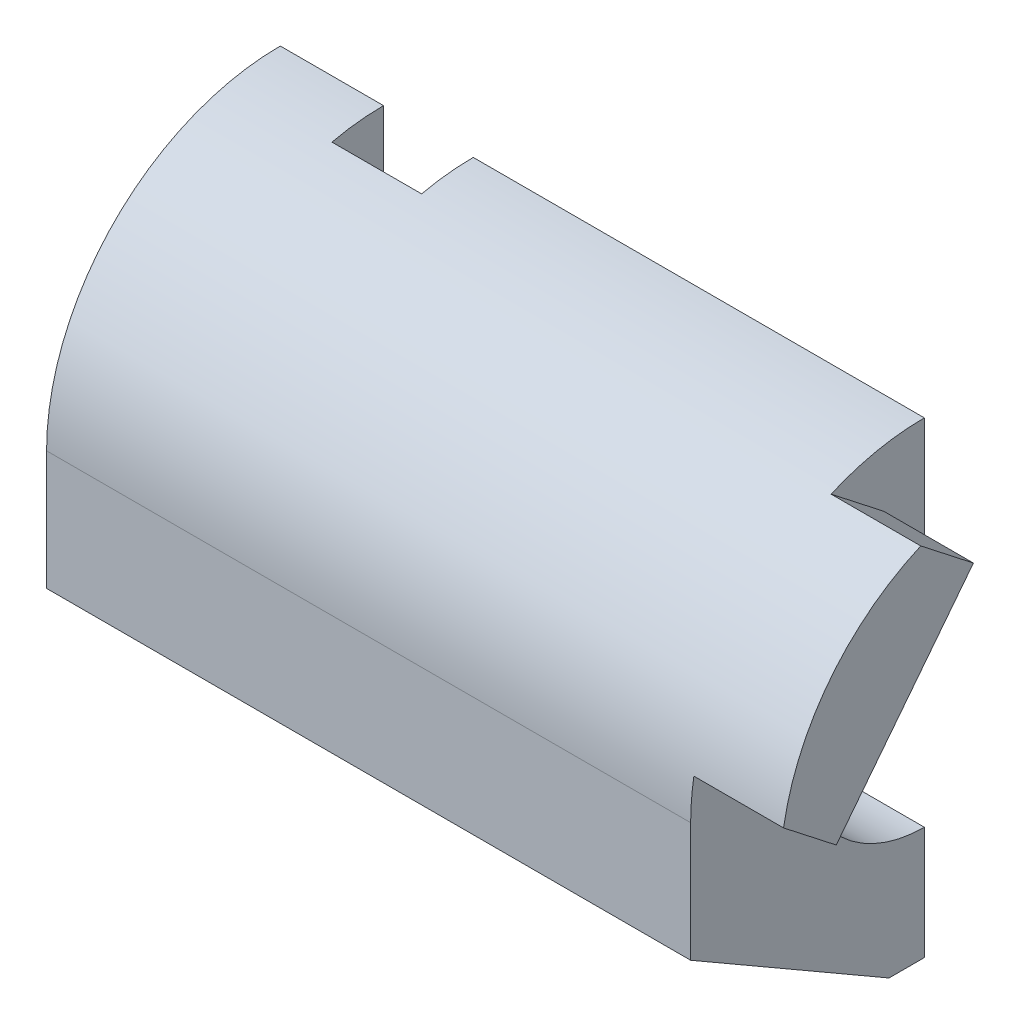
ISO-10303-21;
HEADER;
FILE_DESCRIPTION(('STEP AP214'),'2;1');
FILE_NAME('part.step','',(''),(''),'','','');
FILE_SCHEMA(('AUTOMOTIVE_DESIGN { 1 0 10303 214 1 1 1 1 }'));
ENDSEC;
DATA;
#1=APPLICATION_CONTEXT('core data for automotive mechanical design processes');
#2=APPLICATION_PROTOCOL_DEFINITION('international standard','automotive_design',2000,#1);
#3=PRODUCT_CONTEXT('',#1,'mechanical');
#4=PRODUCT('Part','Part','',(#3));
#5=PRODUCT_RELATED_PRODUCT_CATEGORY('part','',(#4));
#6=PRODUCT_DEFINITION_FORMATION('','',#4);
#7=PRODUCT_DEFINITION_CONTEXT('part definition',#1,'design');
#8=PRODUCT_DEFINITION('design','',#6,#7);
#9=PRODUCT_DEFINITION_SHAPE('','',#8);
#10=(LENGTH_UNIT() NAMED_UNIT(*) SI_UNIT(.MILLI.,.METRE.));
#11=(NAMED_UNIT(*) PLANE_ANGLE_UNIT() SI_UNIT($,.RADIAN.));
#12=(NAMED_UNIT(*) SI_UNIT($,.STERADIAN.) SOLID_ANGLE_UNIT());
#13=UNCERTAINTY_MEASURE_WITH_UNIT(LENGTH_MEASURE(1.E-05),#10,'distance_accuracy_value','');
#14=(GEOMETRIC_REPRESENTATION_CONTEXT(3) GLOBAL_UNCERTAINTY_ASSIGNED_CONTEXT((#13)) GLOBAL_UNIT_ASSIGNED_CONTEXT((#10,
#11,#12)) REPRESENTATION_CONTEXT('',''));
#15=CARTESIAN_POINT('',(0.,0.,0.));
#16=DIRECTION('',(0.,0.,1.));
#17=DIRECTION('',(1.,0.,0.));
#18=AXIS2_PLACEMENT_3D('',#15,#16,#17);
#19=CARTESIAN_POINT('',(-237.,172.,0.));
#20=DIRECTION('',(0.,0.,1.));
#21=DIRECTION('',(0.,-1.,0.));
#22=AXIS2_PLACEMENT_3D('',#19,#20,#21);
#23=PLANE('',#22);
#24=DIRECTION('',(0.,-1.,0.));
#25=VECTOR('',#24,1.);
#26=CARTESIAN_POINT('',(-166.,172.,0.));
#27=LINE('',#26,#25);
#28=CARTESIAN_POINT('',(-166.,172.,0.));
#29=VERTEX_POINT('',#28);
#30=CARTESIAN_POINT('',(-166.,114.575,0.));
#31=VERTEX_POINT('',#30);
#32=EDGE_CURVE('E215',#29,#31,#27,.T.);
#33=ORIENTED_EDGE('',*,*,#32,.F.);
#34=DIRECTION('',(1.,0.,0.));
#35=VECTOR('',#34,1.);
#36=CARTESIAN_POINT('',(-237.,172.,0.));
#37=LINE('',#36,#35);
#38=CARTESIAN_POINT('',(0.,172.,0.));
#39=VERTEX_POINT('',#38);
#40=EDGE_CURVE('E304',#29,#39,#37,.T.);
#41=ORIENTED_EDGE('',*,*,#40,.T.);
#42=DIRECTION('',(0.,-1.,0.));
#43=VECTOR('',#42,1.);
#44=CARTESIAN_POINT('',(0.,172.,0.));
#45=LINE('',#44,#43);
#46=CARTESIAN_POINT('',(0.,130.45,0.));
#47=VERTEX_POINT('',#46);
#48=EDGE_CURVE('E282',#39,#47,#45,.T.);
#49=ORIENTED_EDGE('',*,*,#48,.T.);
#50=DIRECTION('',(1.,0.,0.));
#51=VECTOR('',#50,1.);
#52=CARTESIAN_POINT('',(-78.,130.45,0.));
#53=LINE('',#52,#51);
#54=CARTESIAN_POINT('',(-78.,130.45,0.));
#55=VERTEX_POINT('',#54);
#56=EDGE_CURVE('E278',#55,#47,#53,.T.);
#57=ORIENTED_EDGE('',*,*,#56,.F.);
#58=DIRECTION('',(0.,-1.,0.));
#59=VECTOR('',#58,1.);
#60=CARTESIAN_POINT('',(-78.,0.,0.));
#61=LINE('',#60,#59);
#62=CARTESIAN_POINT('',(-78.,114.575,0.));
#63=VERTEX_POINT('',#62);
#64=EDGE_CURVE('E270',#55,#63,#61,.T.);
#65=ORIENTED_EDGE('',*,*,#64,.T.);
#66=DIRECTION('',(1.,0.,0.));
#67=VECTOR('',#66,1.);
#68=CARTESIAN_POINT('',(-237.,114.575,0.));
#69=LINE('',#68,#67);
#70=EDGE_CURVE('E333',#31,#63,#69,.T.);
#71=ORIENTED_EDGE('',*,*,#70,.F.);
#72=EDGE_LOOP('',(#33,#41,#49,#57,#65,#71));
#73=FACE_BOUND('',#72,.T.);
#74=ADVANCED_FACE('F41',(#73),#23,.F.);
#75=DIRECTION('',(0.,1.,0.));
#76=VECTOR('',#75,1.);
#77=CARTESIAN_POINT('',(-199.,108.034512086846,0.));
#78=LINE('',#77,#76);
#79=CARTESIAN_POINT('',(-199.,114.575,0.));
#80=VERTEX_POINT('',#79);
#81=CARTESIAN_POINT('',(-199.,172.,0.));
#82=VERTEX_POINT('',#81);
#83=EDGE_CURVE('E213',#80,#82,#78,.T.);
#84=ORIENTED_EDGE('',*,*,#83,.F.);
#85=CARTESIAN_POINT('',(-237.,114.575,0.));
#86=VERTEX_POINT('',#85);
#87=EDGE_CURVE('E337',#86,#80,#69,.T.);
#88=ORIENTED_EDGE('',*,*,#87,.F.);
#89=DIRECTION('',(0.,-1.,0.));
#90=VECTOR('',#89,1.);
#91=CARTESIAN_POINT('',(-237.,172.,0.));
#92=LINE('',#91,#90);
#93=CARTESIAN_POINT('',(-237.,172.,0.));
#94=VERTEX_POINT('',#93);
#95=EDGE_CURVE('E287',#94,#86,#92,.T.);
#96=ORIENTED_EDGE('',*,*,#95,.F.);
#97=EDGE_CURVE('E319',#94,#82,#37,.T.);
#98=ORIENTED_EDGE('',*,*,#97,.T.);
#99=EDGE_LOOP('',(#84,#88,#96,#98));
#100=FACE_BOUND('',#99,.T.);
#101=ADVANCED_FACE('F379',(#100),#23,.F.);
#102=CARTESIAN_POINT('',(-237.,57.425,0.));
#103=DIRECTION('',(0.,0.,1.));
#104=DIRECTION('',(0.,-1.,0.));
#105=AXIS2_PLACEMENT_3D('',#102,#103,#104);
#106=PLANE('',#105);
#107=CARTESIAN_POINT('',(-127.,26.,0.));
#108=DIRECTION('',(0.,0.,-1.));
#109=DIRECTION('',(0.,1.,0.));
#110=AXIS2_PLACEMENT_3D('',#107,#108,#109);
#111=CIRCLE('',#110,11.);
#112=CARTESIAN_POINT('',(-127.,37.,0.));
#113=VERTEX_POINT('',#112);
#114=CARTESIAN_POINT('',(-127.,15.,0.));
#115=VERTEX_POINT('',#114);
#116=EDGE_CURVE('E239',#113,#115,#111,.T.);
#117=ORIENTED_EDGE('',*,*,#116,.F.);
#118=DIRECTION('',(-1.,0.,0.));
#119=VECTOR('',#118,1.);
#120=CARTESIAN_POINT('',(-127.,37.,0.));
#121=LINE('',#120,#119);
#122=CARTESIAN_POINT('',(-237.,37.,0.));
#123=VERTEX_POINT('',#122);
#124=EDGE_CURVE('E260',#113,#123,#121,.T.);
#125=ORIENTED_EDGE('',*,*,#124,.T.);
#126=DIRECTION('',(0.,-1.,0.));
#127=VECTOR('',#126,1.);
#128=CARTESIAN_POINT('',(-237.,57.425,0.));
#129=LINE('',#128,#127);
#130=CARTESIAN_POINT('',(-237.,57.425,0.));
#131=VERTEX_POINT('',#130);
#132=EDGE_CURVE('E291',#131,#123,#129,.T.);
#133=ORIENTED_EDGE('',*,*,#132,.F.);
#134=DIRECTION('',(1.,0.,0.));
#135=VECTOR('',#134,1.);
#136=CARTESIAN_POINT('',(-237.,57.425,0.));
#137=LINE('',#136,#135);
#138=CARTESIAN_POINT('',(-78.,57.425,0.));
#139=VERTEX_POINT('',#138);
#140=EDGE_CURVE('E335',#131,#139,#137,.T.);
#141=ORIENTED_EDGE('',*,*,#140,.T.);
#142=DIRECTION('',(0.,-1.,0.));
#143=VECTOR('',#142,1.);
#144=CARTESIAN_POINT('',(-78.,0.,0.));
#145=LINE('',#144,#143);
#146=CARTESIAN_POINT('',(-78.,41.55,0.));
#147=VERTEX_POINT('',#146);
#148=EDGE_CURVE('E271',#139,#147,#145,.T.);
#149=ORIENTED_EDGE('',*,*,#148,.T.);
#150=DIRECTION('',(1.,0.,0.));
#151=VECTOR('',#150,1.);
#152=CARTESIAN_POINT('',(-78.,41.55,0.));
#153=LINE('',#152,#151);
#154=CARTESIAN_POINT('',(0.,41.55,0.));
#155=VERTEX_POINT('',#154);
#156=EDGE_CURVE('E281',#147,#155,#153,.T.);
#157=ORIENTED_EDGE('',*,*,#156,.T.);
#158=DIRECTION('',(0.,-1.,0.));
#159=VECTOR('',#158,1.);
#160=CARTESIAN_POINT('',(0.,57.425,0.));
#161=LINE('',#160,#159);
#162=CARTESIAN_POINT('',(0.,0.,0.));
#163=VERTEX_POINT('',#162);
#164=EDGE_CURVE('E308',#155,#163,#161,.T.);
#165=ORIENTED_EDGE('',*,*,#164,.T.);
#166=DIRECTION('',(1.,0.,0.));
#167=VECTOR('',#166,1.);
#168=CARTESIAN_POINT('',(-237.,0.,0.));
#169=LINE('',#168,#167);
#170=CARTESIAN_POINT('',(-237.,0.,0.));
#171=VERTEX_POINT('',#170);
#172=EDGE_CURVE('E327',#171,#163,#169,.T.);
#173=ORIENTED_EDGE('',*,*,#172,.F.);
#174=CARTESIAN_POINT('',(-237.,15.,0.));
#175=VERTEX_POINT('',#174);
#176=EDGE_CURVE('E292',#175,#171,#129,.T.);
#177=ORIENTED_EDGE('',*,*,#176,.F.);
#178=DIRECTION('',(-1.,0.,0.));
#179=VECTOR('',#178,1.);
#180=CARTESIAN_POINT('',(-127.,15.,0.));
#181=LINE('',#180,#179);
#182=EDGE_CURVE('E252',#115,#175,#181,.T.);
#183=ORIENTED_EDGE('',*,*,#182,.F.);
#184=EDGE_LOOP('',(#117,#125,#133,#141,#149,#157,#165,#173,#177,#183));
#185=FACE_BOUND('',#184,.T.);
#186=ADVANCED_FACE('F383',(#185),#106,.F.);
#187=CARTESIAN_POINT('',(-237.,86.,0.));
#188=DIRECTION('',(1.,0.,0.));
#189=DIRECTION('',(0.,0.,-1.));
#190=AXIS2_PLACEMENT_3D('',#187,#188,#189);
#191=PLANE('',#190);
#192=DIRECTION('',(0.,0.,1.));
#193=VECTOR('',#192,1.);
#194=CARTESIAN_POINT('',(-237.,15.,0.));
#195=LINE('',#194,#193);
#196=CARTESIAN_POINT('',(-237.,15.,13.));
#197=VERTEX_POINT('',#196);
#198=EDGE_CURVE('E242',#175,#197,#195,.T.);
#199=ORIENTED_EDGE('',*,*,#198,.F.);
#200=ORIENTED_EDGE('',*,*,#176,.T.);
#201=DIRECTION('',(0.,0.,1.));
#202=VECTOR('',#201,1.);
#203=CARTESIAN_POINT('',(-237.,0.,0.));
#204=LINE('',#203,#202);
#205=CARTESIAN_POINT('',(-237.,0.,13.));
#206=VERTEX_POINT('',#205);
#207=EDGE_CURVE('E298',#171,#206,#204,.T.);
#208=ORIENTED_EDGE('',*,*,#207,.T.);
#209=DIRECTION('',(0.,0.500000000000001,0.866025403784438));
#210=VECTOR('',#209,1.);
#211=CARTESIAN_POINT('',(-237.,0.,13.));
#212=LINE('',#211,#210);
#213=CARTESIAN_POINT('',(-237.,42.1465696508428,86.));
#214=VERTEX_POINT('',#213);
#215=EDGE_CURVE('E296',#206,#214,#212,.T.);
#216=ORIENTED_EDGE('',*,*,#215,.T.);
#217=DIRECTION('',(0.,1.,0.));
#218=VECTOR('',#217,1.);
#219=CARTESIAN_POINT('',(-237.,42.1465696508428,86.));
#220=LINE('',#219,#218);
#221=CARTESIAN_POINT('',(-237.,86.,86.));
#222=VERTEX_POINT('',#221);
#223=EDGE_CURVE('E297',#214,#222,#220,.T.);
#224=ORIENTED_EDGE('',*,*,#223,.T.);
#225=CARTESIAN_POINT('',(-237.,86.,0.));
#226=DIRECTION('',(1.,0.,0.));
#227=DIRECTION('',(0.,0.,-1.));
#228=AXIS2_PLACEMENT_3D('',#225,#226,#227);
#229=CIRCLE('',#228,86.);
#230=EDGE_CURVE('E305',#94,#222,#229,.T.);
#231=ORIENTED_EDGE('',*,*,#230,.F.);
#232=ORIENTED_EDGE('',*,*,#95,.T.);
#233=CARTESIAN_POINT('',(-237.,86.,0.));
#234=DIRECTION('',(1.,0.,0.));
#235=DIRECTION('',(0.,0.,-1.));
#236=AXIS2_PLACEMENT_3D('',#233,#234,#235);
#237=CIRCLE('',#236,28.575);
#238=EDGE_CURVE('E286',#86,#131,#237,.T.);
#239=ORIENTED_EDGE('',*,*,#238,.T.);
#240=ORIENTED_EDGE('',*,*,#132,.T.);
#241=DIRECTION('',(0.,0.,-1.));
#242=VECTOR('',#241,1.);
#243=CARTESIAN_POINT('',(-237.,37.,0.));
#244=LINE('',#243,#242);
#245=CARTESIAN_POINT('',(-237.,37.,13.));
#246=VERTEX_POINT('',#245);
#247=EDGE_CURVE('E248',#246,#123,#244,.T.);
#248=ORIENTED_EDGE('',*,*,#247,.F.);
#249=DIRECTION('',(0.,1.,0.));
#250=VECTOR('',#249,1.);
#251=CARTESIAN_POINT('',(-237.,15.,13.));
#252=LINE('',#251,#250);
#253=EDGE_CURVE('E254',#197,#246,#252,.T.);
#254=ORIENTED_EDGE('',*,*,#253,.F.);
#255=EDGE_LOOP('',(#199,#200,#208,#216,#224,#231,#232,#239,#240,#248,#254));
#256=FACE_BOUND('',#255,.T.);
#257=ADVANCED_FACE('F391',(#256),#191,.F.);
#258=CARTESIAN_POINT('',(-237.,86.,0.));
#259=DIRECTION('',(1.,0.,0.));
#260=DIRECTION('',(0.,0.,-1.));
#261=AXIS2_PLACEMENT_3D('',#258,#259,#260);
#262=CYLINDRICAL_SURFACE('',#261,28.575);
#263=DIRECTION('',(1.,0.,0.));
#264=VECTOR('',#263,1.);
#265=CARTESIAN_POINT('',(-237.,108.034512086846,18.1937050128512));
#266=LINE('',#265,#264);
#267=CARTESIAN_POINT('',(-199.,108.034512086846,18.1937050128512));
#268=VERTEX_POINT('',#267);
#269=CARTESIAN_POINT('',(-166.,108.034512086846,18.1937050128512));
#270=VERTEX_POINT('',#269);
#271=EDGE_CURVE('E11',#268,#270,#266,.T.);
#272=ORIENTED_EDGE('',*,*,#271,.T.);
#273=CARTESIAN_POINT('',(-166.,86.,0.));
#274=DIRECTION('',(1.,0.,0.));
#275=DIRECTION('',(0.,0.,-1.));
#276=AXIS2_PLACEMENT_3D('',#273,#274,#275);
#277=CIRCLE('',#276,28.575);
#278=EDGE_CURVE('E240',#270,#31,#277,.F.);
#279=ORIENTED_EDGE('',*,*,#278,.T.);
#280=ORIENTED_EDGE('',*,*,#70,.T.);
#281=CARTESIAN_POINT('',(-78.,86.,0.));
#282=DIRECTION('',(1.,0.,0.));
#283=DIRECTION('',(0.,0.,-1.));
#284=AXIS2_PLACEMENT_3D('',#281,#282,#283);
#285=CIRCLE('',#284,28.575);
#286=EDGE_CURVE('E276',#63,#139,#285,.T.);
#287=ORIENTED_EDGE('',*,*,#286,.T.);
#288=ORIENTED_EDGE('',*,*,#140,.F.);
#289=ORIENTED_EDGE('',*,*,#238,.F.);
#290=ORIENTED_EDGE('',*,*,#87,.T.);
#291=CARTESIAN_POINT('',(-199.,86.,0.));
#292=DIRECTION('',(-1.,0.,0.));
#293=DIRECTION('',(0.,0.,1.));
#294=AXIS2_PLACEMENT_3D('',#291,#292,#293);
#295=CIRCLE('',#294,28.575);
#296=EDGE_CURVE('E235',#80,#268,#295,.F.);
#297=ORIENTED_EDGE('',*,*,#296,.T.);
#298=EDGE_LOOP('',(#272,#279,#280,#287,#288,#289,#290,#297));
#299=FACE_BOUND('',#298,.T.);
#300=ADVANCED_FACE('F398',(#299),#262,.F.);
#301=CARTESIAN_POINT('',(-237.,0.,0.));
#302=DIRECTION('',(0.,1.,0.));
#303=DIRECTION('',(0.,0.,1.));
#304=AXIS2_PLACEMENT_3D('',#301,#302,#303);
#305=PLANE('',#304);
#306=DIRECTION('',(0.,0.,1.));
#307=VECTOR('',#306,1.);
#308=CARTESIAN_POINT('',(0.,0.,0.));
#309=LINE('',#308,#307);
#310=CARTESIAN_POINT('',(0.,0.,13.));
#311=VERTEX_POINT('',#310);
#312=EDGE_CURVE('E309',#163,#311,#309,.T.);
#313=ORIENTED_EDGE('',*,*,#312,.T.);
#314=DIRECTION('',(1.,0.,0.));
#315=VECTOR('',#314,1.);
#316=CARTESIAN_POINT('',(-237.,0.,13.));
#317=LINE('',#316,#315);
#318=EDGE_CURVE('E326',#206,#311,#317,.T.);
#319=ORIENTED_EDGE('',*,*,#318,.F.);
#320=ORIENTED_EDGE('',*,*,#207,.F.);
#321=ORIENTED_EDGE('',*,*,#172,.T.);
#322=EDGE_LOOP('',(#313,#319,#320,#321));
#323=FACE_BOUND('',#322,.T.);
#324=ADVANCED_FACE('F429',(#323),#305,.F.);
#325=CARTESIAN_POINT('',(-237.,0.,13.));
#326=DIRECTION('',(0.,0.866025403784438,-0.500000000000001));
#327=DIRECTION('',(0.,0.500000000000001,0.866025403784438));
#328=AXIS2_PLACEMENT_3D('',#325,#326,#327);
#329=PLANE('',#328);
#330=DIRECTION('',(0.,0.500000000000001,0.866025403784438));
#331=VECTOR('',#330,1.);
#332=CARTESIAN_POINT('',(0.,0.,13.));
#333=LINE('',#332,#331);
#334=CARTESIAN_POINT('',(0.,42.1465696508428,86.));
#335=VERTEX_POINT('',#334);
#336=EDGE_CURVE('E315',#311,#335,#333,.T.);
#337=ORIENTED_EDGE('',*,*,#336,.T.);
#338=DIRECTION('',(1.,0.,0.));
#339=VECTOR('',#338,1.);
#340=CARTESIAN_POINT('',(-237.,42.1465696508428,86.));
#341=LINE('',#340,#339);
#342=EDGE_CURVE('E322',#214,#335,#341,.T.);
#343=ORIENTED_EDGE('',*,*,#342,.F.);
#344=ORIENTED_EDGE('',*,*,#215,.F.);
#345=ORIENTED_EDGE('',*,*,#318,.T.);
#346=EDGE_LOOP('',(#337,#343,#344,#345));
#347=FACE_BOUND('',#346,.T.);
#348=ADVANCED_FACE('F472',(#347),#329,.F.);
#349=CARTESIAN_POINT('',(-237.,42.1465696508428,86.));
#350=DIRECTION('',(0.,0.,-1.));
#351=DIRECTION('',(0.,1.,0.));
#352=AXIS2_PLACEMENT_3D('',#349,#350,#351);
#353=PLANE('',#352);
#354=DIRECTION('',(0.,1.,0.));
#355=VECTOR('',#354,1.);
#356=CARTESIAN_POINT('',(0.,42.1465696508428,86.));
#357=LINE('',#356,#355);
#358=CARTESIAN_POINT('',(0.,86.,86.));
#359=VERTEX_POINT('',#358);
#360=EDGE_CURVE('E313',#335,#359,#357,.T.);
#361=ORIENTED_EDGE('',*,*,#360,.T.);
#362=DIRECTION('',(1.,0.,0.));
#363=VECTOR('',#362,1.);
#364=CARTESIAN_POINT('',(-237.,86.,86.));
#365=LINE('',#364,#363);
#366=EDGE_CURVE('E321',#222,#359,#365,.T.);
#367=ORIENTED_EDGE('',*,*,#366,.F.);
#368=ORIENTED_EDGE('',*,*,#223,.F.);
#369=ORIENTED_EDGE('',*,*,#342,.T.);
#370=EDGE_LOOP('',(#361,#367,#368,#369));
#371=FACE_BOUND('',#370,.T.);
#372=ADVANCED_FACE('F468',(#371),#353,.F.);
#373=CARTESIAN_POINT('',(-237.,86.,0.));
#374=DIRECTION('',(1.,0.,0.));
#375=DIRECTION('',(0.,0.,-1.));
#376=AXIS2_PLACEMENT_3D('',#373,#374,#375);
#377=CYLINDRICAL_SURFACE('',#376,86.);
#378=CARTESIAN_POINT('',(-166.,86.,0.));
#379=DIRECTION('',(1.,0.,0.));
#380=DIRECTION('',(0.,0.,-1.));
#381=AXIS2_PLACEMENT_3D('',#378,#379,#380);
#382=CIRCLE('',#381,86.);
#383=CARTESIAN_POINT('',(-166.,169.874906855388,19.));
#384=VERTEX_POINT('',#383);
#385=EDGE_CURVE('E48',#384,#29,#382,.F.);
#386=ORIENTED_EDGE('',*,*,#385,.F.);
#387=DIRECTION('',(1.,0.,0.));
#388=VECTOR('',#387,1.);
#389=CARTESIAN_POINT('',(-237.,169.874906855388,19.));
#390=LINE('',#389,#388);
#391=CARTESIAN_POINT('',(-199.,169.874906855388,19.));
#392=VERTEX_POINT('',#391);
#393=EDGE_CURVE('E339',#384,#392,#390,.F.);
#394=ORIENTED_EDGE('',*,*,#393,.T.);
#395=CARTESIAN_POINT('',(-199.,86.,0.));
#396=DIRECTION('',(-1.,0.,0.));
#397=DIRECTION('',(0.,0.,1.));
#398=AXIS2_PLACEMENT_3D('',#395,#396,#397);
#399=CIRCLE('',#398,86.);
#400=EDGE_CURVE('E345',#82,#392,#399,.F.);
#401=ORIENTED_EDGE('',*,*,#400,.F.);
#402=ORIENTED_EDGE('',*,*,#97,.F.);
#403=ORIENTED_EDGE('',*,*,#230,.T.);
#404=ORIENTED_EDGE('',*,*,#366,.T.);
#405=CARTESIAN_POINT('',(0.,86.,0.));
#406=DIRECTION('',(1.,0.,0.));
#407=DIRECTION('',(0.,0.,-1.));
#408=AXIS2_PLACEMENT_3D('',#405,#406,#407);
#409=CIRCLE('',#408,86.);
#410=CARTESIAN_POINT('',(0.,100.234100753004,84.8138572153945));
#411=VERTEX_POINT('',#410);
#412=EDGE_CURVE('E211',#411,#359,#409,.T.);
#413=ORIENTED_EDGE('',*,*,#412,.F.);
#414=DIRECTION('',(-1.,0.,0.));
#415=VECTOR('',#414,1.);
#416=CARTESIAN_POINT('',(33.,100.234100753004,84.8138572153944));
#417=LINE('',#416,#415);
#418=CARTESIAN_POINT('',(33.,100.234100753004,84.8138572153944));
#419=VERTEX_POINT('',#418);
#420=EDGE_CURVE('E195',#419,#411,#417,.T.);
#421=ORIENTED_EDGE('',*,*,#420,.F.);
#422=CARTESIAN_POINT('',(33.,86.,0.));
#423=DIRECTION('',(1.,0.,0.));
#424=DIRECTION('',(0.,0.,-1.));
#425=AXIS2_PLACEMENT_3D('',#422,#423,#424);
#426=CIRCLE('',#425,86.);
#427=CARTESIAN_POINT('',(33.,164.850982548756,34.3296162386909));
#428=VERTEX_POINT('',#427);
#429=EDGE_CURVE('E198',#428,#419,#426,.T.);
#430=ORIENTED_EDGE('',*,*,#429,.F.);
#431=DIRECTION('',(-1.,0.,0.));
#432=VECTOR('',#431,1.);
#433=CARTESIAN_POINT('',(33.,164.850982548756,34.3296162386909));
#434=LINE('',#433,#432);
#435=CARTESIAN_POINT('',(0.,164.850982548756,34.3296162386909));
#436=VERTEX_POINT('',#435);
#437=EDGE_CURVE('E351',#428,#436,#434,.T.);
#438=ORIENTED_EDGE('',*,*,#437,.T.);
#439=EDGE_CURVE('E288',#39,#436,#409,.T.);
#440=ORIENTED_EDGE('',*,*,#439,.F.);
#441=ORIENTED_EDGE('',*,*,#40,.F.);
#442=EDGE_LOOP('',(#386,#394,#401,#402,#403,#404,#413,#421,#430,#438,#440,#441));
#443=FACE_BOUND('',#442,.T.);
#444=ADVANCED_FACE('F209',(#443),#377,.T.);
#445=CARTESIAN_POINT('',(0.,86.,0.));
#446=DIRECTION('',(1.,0.,0.));
#447=DIRECTION('',(0.,0.,-1.));
#448=AXIS2_PLACEMENT_3D('',#445,#446,#447);
#449=PLANE('',#448);
#450=DIRECTION('',(0.,0.615661475325651,0.788010753606728));
#451=VECTOR('',#450,1.);
#452=CARTESIAN_POINT('',(0.,149.707176139484,14.9464279455914));
#453=LINE('',#452,#451);
#454=CARTESIAN_POINT('',(0.,149.707176139484,14.9464279455914));
#455=VERTEX_POINT('',#454);
#456=EDGE_CURVE('E54',#455,#436,#453,.T.);
#457=ORIENTED_EDGE('',*,*,#456,.F.);
#458=DIRECTION('',(0.,0.788010753606728,-0.61566147532565));
#459=VECTOR('',#458,1.);
#460=CARTESIAN_POINT('',(0.,85.0902943437325,65.4306689222947));
#461=LINE('',#460,#459);
#462=CARTESIAN_POINT('',(0.,85.0902943437325,65.4306689222947));
#463=VERTEX_POINT('',#462);
#464=EDGE_CURVE('E363',#463,#455,#461,.T.);
#465=ORIENTED_EDGE('',*,*,#464,.F.);
#466=DIRECTION('',(0.,-0.615661475325654,-0.788010753606726));
#467=VECTOR('',#466,1.);
#468=CARTESIAN_POINT('',(0.,100.234100753004,84.8138572153944));
#469=LINE('',#468,#467);
#470=EDGE_CURVE('E61',#411,#463,#469,.T.);
#471=ORIENTED_EDGE('',*,*,#470,.F.);
#472=ORIENTED_EDGE('',*,*,#412,.T.);
#473=ORIENTED_EDGE('',*,*,#360,.F.);
#474=ORIENTED_EDGE('',*,*,#336,.F.);
#475=ORIENTED_EDGE('',*,*,#312,.F.);
#476=ORIENTED_EDGE('',*,*,#164,.F.);
#477=CARTESIAN_POINT('',(0.,86.,0.));
#478=DIRECTION('',(1.,0.,0.));
#479=DIRECTION('',(0.,0.,-1.));
#480=AXIS2_PLACEMENT_3D('',#477,#478,#479);
#481=CIRCLE('',#480,44.45);
#482=EDGE_CURVE('E259',#47,#155,#481,.T.);
#483=ORIENTED_EDGE('',*,*,#482,.F.);
#484=ORIENTED_EDGE('',*,*,#48,.F.);
#485=ORIENTED_EDGE('',*,*,#439,.T.);
#486=EDGE_LOOP('',(#457,#465,#471,#472,#473,#474,#475,#476,#483,#484,#485));
#487=FACE_BOUND('',#486,.T.);
#488=ADVANCED_FACE('F353',(#487),#449,.T.);
#489=CARTESIAN_POINT('',(-78.,86.,0.));
#490=DIRECTION('',(1.,0.,0.));
#491=DIRECTION('',(0.,0.,-1.));
#492=AXIS2_PLACEMENT_3D('',#489,#490,#491);
#493=CYLINDRICAL_SURFACE('',#492,44.45);
#494=ORIENTED_EDGE('',*,*,#482,.T.);
#495=ORIENTED_EDGE('',*,*,#156,.F.);
#496=CARTESIAN_POINT('',(-78.,86.,0.));
#497=DIRECTION('',(1.,0.,0.));
#498=DIRECTION('',(0.,0.,-1.));
#499=AXIS2_PLACEMENT_3D('',#496,#497,#498);
#500=CIRCLE('',#499,44.45);
#501=EDGE_CURVE('E268',#55,#147,#500,.T.);
#502=ORIENTED_EDGE('',*,*,#501,.F.);
#503=ORIENTED_EDGE('',*,*,#56,.T.);
#504=EDGE_LOOP('',(#494,#495,#502,#503));
#505=FACE_BOUND('',#504,.T.);
#506=ADVANCED_FACE('F418',(#505),#493,.F.);
#507=CARTESIAN_POINT('',(-78.,0.,0.));
#508=DIRECTION('',(1.,0.,0.));
#509=DIRECTION('',(0.,0.,-1.));
#510=AXIS2_PLACEMENT_3D('',#507,#508,#509);
#511=PLANE('',#510);
#512=ORIENTED_EDGE('',*,*,#64,.F.);
#513=ORIENTED_EDGE('',*,*,#501,.T.);
#514=ORIENTED_EDGE('',*,*,#148,.F.);
#515=ORIENTED_EDGE('',*,*,#286,.F.);
#516=EDGE_LOOP('',(#512,#513,#514,#515));
#517=FACE_BOUND('',#516,.T.);
#518=ADVANCED_FACE('F417',(#517),#511,.T.);
#519=CARTESIAN_POINT('',(-127.,37.,0.));
#520=DIRECTION('',(0.,1.,0.));
#521=DIRECTION('',(0.,0.,1.));
#522=AXIS2_PLACEMENT_3D('',#519,#520,#521);
#523=PLANE('',#522);
#524=ORIENTED_EDGE('',*,*,#247,.T.);
#525=ORIENTED_EDGE('',*,*,#124,.F.);
#526=DIRECTION('',(0.,0.,-1.));
#527=VECTOR('',#526,1.);
#528=CARTESIAN_POINT('',(-127.,37.,0.));
#529=LINE('',#528,#527);
#530=CARTESIAN_POINT('',(-127.,37.,13.));
#531=VERTEX_POINT('',#530);
#532=EDGE_CURVE('E247',#531,#113,#529,.T.);
#533=ORIENTED_EDGE('',*,*,#532,.F.);
#534=DIRECTION('',(-1.,0.,0.));
#535=VECTOR('',#534,1.);
#536=CARTESIAN_POINT('',(-127.,37.,13.));
#537=LINE('',#536,#535);
#538=EDGE_CURVE('E261',#531,#246,#537,.T.);
#539=ORIENTED_EDGE('',*,*,#538,.T.);
#540=EDGE_LOOP('',(#524,#525,#533,#539));
#541=FACE_BOUND('',#540,.T.);
#542=ADVANCED_FACE('F449',(#541),#523,.F.);
#543=CARTESIAN_POINT('',(-127.,15.,13.));
#544=DIRECTION('',(0.,0.,1.));
#545=DIRECTION('',(0.,-1.,0.));
#546=AXIS2_PLACEMENT_3D('',#543,#544,#545);
#547=PLANE('',#546);
#548=ORIENTED_EDGE('',*,*,#538,.F.);
#549=CARTESIAN_POINT('',(-127.,26.,13.));
#550=DIRECTION('',(0.,0.,-1.));
#551=DIRECTION('',(0.,1.,0.));
#552=AXIS2_PLACEMENT_3D('',#549,#550,#551);
#553=CIRCLE('',#552,11.);
#554=CARTESIAN_POINT('',(-127.,15.,13.));
#555=VERTEX_POINT('',#554);
#556=EDGE_CURVE('E241',#531,#555,#553,.T.);
#557=ORIENTED_EDGE('',*,*,#556,.T.);
#558=DIRECTION('',(-1.,0.,0.));
#559=VECTOR('',#558,1.);
#560=CARTESIAN_POINT('',(-127.,15.,13.));
#561=LINE('',#560,#559);
#562=EDGE_CURVE('E263',#555,#197,#561,.T.);
#563=ORIENTED_EDGE('',*,*,#562,.T.);
#564=ORIENTED_EDGE('',*,*,#253,.T.);
#565=EDGE_LOOP('',(#548,#557,#563,#564));
#566=FACE_BOUND('',#565,.T.);
#567=ADVANCED_FACE('F443',(#566),#547,.F.);
#568=CARTESIAN_POINT('',(-127.,15.,0.));
#569=DIRECTION('',(0.,-1.,0.));
#570=DIRECTION('',(0.,0.,-1.));
#571=AXIS2_PLACEMENT_3D('',#568,#569,#570);
#572=PLANE('',#571);
#573=ORIENTED_EDGE('',*,*,#198,.T.);
#574=ORIENTED_EDGE('',*,*,#562,.F.);
#575=DIRECTION('',(0.,0.,1.));
#576=VECTOR('',#575,1.);
#577=CARTESIAN_POINT('',(-127.,15.,0.));
#578=LINE('',#577,#576);
#579=EDGE_CURVE('E246',#115,#555,#578,.T.);
#580=ORIENTED_EDGE('',*,*,#579,.F.);
#581=ORIENTED_EDGE('',*,*,#182,.T.);
#582=EDGE_LOOP('',(#573,#574,#580,#581));
#583=FACE_BOUND('',#582,.T.);
#584=ADVANCED_FACE('F438',(#583),#572,.F.);
#585=CARTESIAN_POINT('',(-127.,26.,13.));
#586=DIRECTION('',(0.,0.,-1.));
#587=DIRECTION('',(0.,1.,0.));
#588=AXIS2_PLACEMENT_3D('',#585,#586,#587);
#589=CYLINDRICAL_SURFACE('',#588,11.);
#590=ORIENTED_EDGE('',*,*,#556,.F.);
#591=ORIENTED_EDGE('',*,*,#532,.T.);
#592=ORIENTED_EDGE('',*,*,#116,.T.);
#593=ORIENTED_EDGE('',*,*,#579,.T.);
#594=EDGE_LOOP('',(#590,#591,#592,#593));
#595=FACE_BOUND('',#594,.T.);
#596=ADVANCED_FACE('F441',(#595),#589,.F.);
#597=CARTESIAN_POINT('',(-166.,108.034512086846,19.));
#598=DIRECTION('',(0.,-1.,0.));
#599=DIRECTION('',(0.,0.,-1.));
#600=AXIS2_PLACEMENT_3D('',#597,#598,#599);
#601=PLANE('',#600);
#602=DIRECTION('',(0.,0.,-1.));
#603=VECTOR('',#602,1.);
#604=CARTESIAN_POINT('',(-199.,108.034512086846,19.));
#605=LINE('',#604,#603);
#606=CARTESIAN_POINT('',(-199.,108.034512086846,19.));
#607=VERTEX_POINT('',#606);
#608=EDGE_CURVE('E230',#607,#268,#605,.T.);
#609=ORIENTED_EDGE('',*,*,#608,.F.);
#610=DIRECTION('',(-1.,0.,0.));
#611=VECTOR('',#610,1.);
#612=CARTESIAN_POINT('',(-166.,108.034512086846,19.));
#613=LINE('',#612,#611);
#614=CARTESIAN_POINT('',(-166.,108.034512086846,19.));
#615=VERTEX_POINT('',#614);
#616=EDGE_CURVE('E225',#615,#607,#613,.T.);
#617=ORIENTED_EDGE('',*,*,#616,.F.);
#618=DIRECTION('',(0.,0.,-1.));
#619=VECTOR('',#618,1.);
#620=CARTESIAN_POINT('',(-166.,108.034512086846,19.));
#621=LINE('',#620,#619);
#622=EDGE_CURVE('E228',#615,#270,#621,.T.);
#623=ORIENTED_EDGE('',*,*,#622,.T.);
#624=ORIENTED_EDGE('',*,*,#271,.F.);
#625=EDGE_LOOP('',(#609,#617,#623,#624));
#626=FACE_BOUND('',#625,.T.);
#627=ADVANCED_FACE('F413',(#626),#601,.F.);
#628=CARTESIAN_POINT('',(-166.,172.,19.));
#629=DIRECTION('',(1.,0.,0.));
#630=DIRECTION('',(0.,0.,-1.));
#631=AXIS2_PLACEMENT_3D('',#628,#629,#630);
#632=PLANE('',#631);
#633=ORIENTED_EDGE('',*,*,#622,.F.);
#634=DIRECTION('',(0.,-1.,0.));
#635=VECTOR('',#634,1.);
#636=CARTESIAN_POINT('',(-166.,172.,19.));
#637=LINE('',#636,#635);
#638=EDGE_CURVE('E219',#384,#615,#637,.T.);
#639=ORIENTED_EDGE('',*,*,#638,.F.);
#640=ORIENTED_EDGE('',*,*,#385,.T.);
#641=ORIENTED_EDGE('',*,*,#32,.T.);
#642=ORIENTED_EDGE('',*,*,#278,.F.);
#643=EDGE_LOOP('',(#633,#639,#640,#641,#642));
#644=FACE_BOUND('',#643,.T.);
#645=ADVANCED_FACE('F348',(#644),#632,.F.);
#646=CARTESIAN_POINT('',(-199.,108.034512086846,19.));
#647=DIRECTION('',(-1.,0.,0.));
#648=DIRECTION('',(0.,0.,1.));
#649=AXIS2_PLACEMENT_3D('',#646,#647,#648);
#650=PLANE('',#649);
#651=ORIENTED_EDGE('',*,*,#83,.T.);
#652=ORIENTED_EDGE('',*,*,#400,.T.);
#653=DIRECTION('',(0.,1.,0.));
#654=VECTOR('',#653,1.);
#655=CARTESIAN_POINT('',(-199.,108.034512086846,19.));
#656=LINE('',#655,#654);
#657=EDGE_CURVE('E223',#607,#392,#656,.T.);
#658=ORIENTED_EDGE('',*,*,#657,.F.);
#659=ORIENTED_EDGE('',*,*,#608,.T.);
#660=ORIENTED_EDGE('',*,*,#296,.F.);
#661=EDGE_LOOP('',(#651,#652,#658,#659,#660));
#662=FACE_BOUND('',#661,.T.);
#663=ADVANCED_FACE('F408',(#662),#650,.F.);
#664=CARTESIAN_POINT('',(0.,0.,19.));
#665=DIRECTION('',(0.,0.,-1.));
#666=DIRECTION('',(0.,1.,0.));
#667=AXIS2_PLACEMENT_3D('',#664,#665,#666);
#668=PLANE('',#667);
#669=ORIENTED_EDGE('',*,*,#638,.T.);
#670=ORIENTED_EDGE('',*,*,#616,.T.);
#671=ORIENTED_EDGE('',*,*,#657,.T.);
#672=ORIENTED_EDGE('',*,*,#393,.F.);
#673=EDGE_LOOP('',(#669,#670,#671,#672));
#674=FACE_BOUND('',#673,.T.);
#675=ADVANCED_FACE('F380',(#674),#668,.T.);
#676=CARTESIAN_POINT('',(33.,100.234100753004,84.8138572153944));
#677=DIRECTION('',(0.,0.788010753606726,-0.615661475325654));
#678=DIRECTION('',(0.,0.615661475325654,0.788010753606726));
#679=AXIS2_PLACEMENT_3D('',#676,#677,#678);
#680=PLANE('',#679);
#681=ORIENTED_EDGE('',*,*,#470,.T.);
#682=DIRECTION('',(-1.,0.,0.));
#683=VECTOR('',#682,1.);
#684=CARTESIAN_POINT('',(33.,85.0902943437325,65.4306689222947));
#685=LINE('',#684,#683);
#686=CARTESIAN_POINT('',(33.,85.0902943437325,65.4306689222947));
#687=VERTEX_POINT('',#686);
#688=EDGE_CURVE('E193',#687,#463,#685,.T.);
#689=ORIENTED_EDGE('',*,*,#688,.F.);
#690=DIRECTION('',(0.,-0.615661475325654,-0.788010753606726));
#691=VECTOR('',#690,1.);
#692=CARTESIAN_POINT('',(33.,100.234100753004,84.8138572153944));
#693=LINE('',#692,#691);
#694=EDGE_CURVE('E189',#419,#687,#693,.T.);
#695=ORIENTED_EDGE('',*,*,#694,.F.);
#696=ORIENTED_EDGE('',*,*,#420,.T.);
#697=EDGE_LOOP('',(#681,#689,#695,#696));
#698=FACE_BOUND('',#697,.T.);
#699=ADVANCED_FACE('F188',(#698),#680,.F.);
#700=CARTESIAN_POINT('',(33.,85.0902943437325,65.4306689222947));
#701=DIRECTION('',(0.,0.61566147532565,0.788010753606728));
#702=DIRECTION('',(0.,-0.788010753606728,0.61566147532565));
#703=AXIS2_PLACEMENT_3D('',#700,#701,#702);
#704=PLANE('',#703);
#705=ORIENTED_EDGE('',*,*,#464,.T.);
#706=DIRECTION('',(-1.,0.,0.));
#707=VECTOR('',#706,1.);
#708=CARTESIAN_POINT('',(33.,149.707176139484,14.9464279455914));
#709=LINE('',#708,#707);
#710=CARTESIAN_POINT('',(33.,149.707176139484,14.9464279455914));
#711=VERTEX_POINT('',#710);
#712=EDGE_CURVE('E216',#711,#455,#709,.T.);
#713=ORIENTED_EDGE('',*,*,#712,.F.);
#714=DIRECTION('',(0.,0.788010753606728,-0.61566147532565));
#715=VECTOR('',#714,1.);
#716=CARTESIAN_POINT('',(33.,85.0902943437325,65.4306689222947));
#717=LINE('',#716,#715);
#718=EDGE_CURVE('E200',#687,#711,#717,.T.);
#719=ORIENTED_EDGE('',*,*,#718,.F.);
#720=ORIENTED_EDGE('',*,*,#688,.T.);
#721=EDGE_LOOP('',(#705,#713,#719,#720));
#722=FACE_BOUND('',#721,.T.);
#723=ADVANCED_FACE('F367',(#722),#704,.F.);
#724=CARTESIAN_POINT('',(33.,149.707176139484,14.9464279455914));
#725=DIRECTION('',(0.,-0.788010753606728,0.615661475325651));
#726=DIRECTION('',(0.,-0.615661475325651,-0.788010753606728));
#727=AXIS2_PLACEMENT_3D('',#724,#725,#726);
#728=PLANE('',#727);
#729=ORIENTED_EDGE('',*,*,#456,.T.);
#730=ORIENTED_EDGE('',*,*,#437,.F.);
#731=DIRECTION('',(0.,0.615661475325651,0.788010753606728));
#732=VECTOR('',#731,1.);
#733=CARTESIAN_POINT('',(33.,149.707176139484,14.9464279455914));
#734=LINE('',#733,#732);
#735=EDGE_CURVE('E204',#711,#428,#734,.T.);
#736=ORIENTED_EDGE('',*,*,#735,.F.);
#737=ORIENTED_EDGE('',*,*,#712,.T.);
#738=EDGE_LOOP('',(#729,#730,#736,#737));
#739=FACE_BOUND('',#738,.T.);
#740=ADVANCED_FACE('F360',(#739),#728,.F.);
#741=CARTESIAN_POINT('',(33.,86.,0.));
#742=DIRECTION('',(1.,0.,0.));
#743=DIRECTION('',(0.,0.,-1.));
#744=AXIS2_PLACEMENT_3D('',#741,#742,#743);
#745=PLANE('',#744);
#746=ORIENTED_EDGE('',*,*,#429,.T.);
#747=ORIENTED_EDGE('',*,*,#694,.T.);
#748=ORIENTED_EDGE('',*,*,#718,.T.);
#749=ORIENTED_EDGE('',*,*,#735,.T.);
#750=EDGE_LOOP('',(#746,#747,#748,#749));
#751=FACE_BOUND('',#750,.T.);
#752=ADVANCED_FACE('F202',(#751),#745,.T.);
#753=CLOSED_SHELL('',(#74,#101,#186,#257,#300,#324,#348,#372,#444,#488,#506,#518,#542,#567,#584,
#596,#627,#645,#663,#675,#699,#723,#740,#752));
#754=MANIFOLD_SOLID_BREP('B2',#753);
#755=ADVANCED_BREP_SHAPE_REPRESENTATION('',(#18,#754),#14);
#756=SHAPE_DEFINITION_REPRESENTATION(#9,#755);
ENDSEC;
END-ISO-10303-21;
